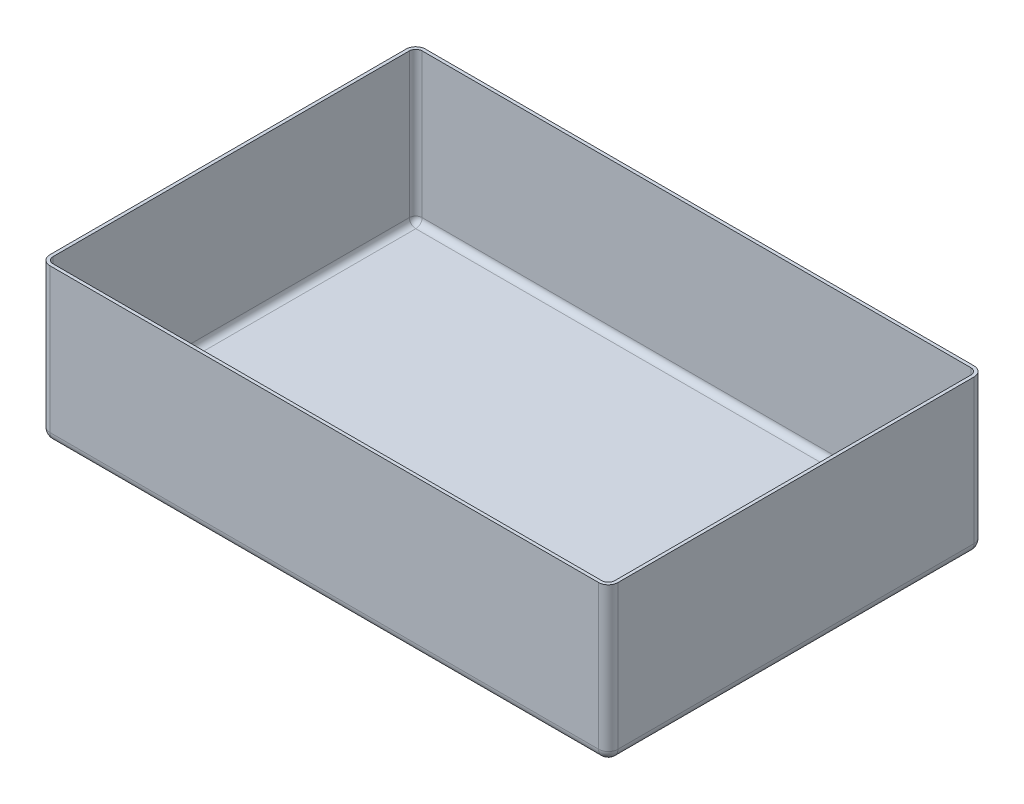
ISO-10303-21;
HEADER;
FILE_DESCRIPTION(('STEP AP214'),'2;1');
FILE_NAME('part.step','',(''),(''),'','','');
FILE_SCHEMA(('AUTOMOTIVE_DESIGN { 1 0 10303 214 1 1 1 1 }'));
ENDSEC;
DATA;
#1=APPLICATION_CONTEXT('core data for automotive mechanical design processes');
#2=APPLICATION_PROTOCOL_DEFINITION('international standard','automotive_design',2000,#1);
#3=PRODUCT_CONTEXT('',#1,'mechanical');
#4=PRODUCT('Part','Part','',(#3));
#5=PRODUCT_RELATED_PRODUCT_CATEGORY('part','',(#4));
#6=PRODUCT_DEFINITION_FORMATION('','',#4);
#7=PRODUCT_DEFINITION_CONTEXT('part definition',#1,'design');
#8=PRODUCT_DEFINITION('design','',#6,#7);
#9=PRODUCT_DEFINITION_SHAPE('','',#8);
#10=(LENGTH_UNIT() NAMED_UNIT(*) SI_UNIT(.MILLI.,.METRE.));
#11=(NAMED_UNIT(*) PLANE_ANGLE_UNIT() SI_UNIT($,.RADIAN.));
#12=(NAMED_UNIT(*) SI_UNIT($,.STERADIAN.) SOLID_ANGLE_UNIT());
#13=UNCERTAINTY_MEASURE_WITH_UNIT(LENGTH_MEASURE(1.E-05),#10,'distance_accuracy_value','');
#14=(GEOMETRIC_REPRESENTATION_CONTEXT(3) GLOBAL_UNCERTAINTY_ASSIGNED_CONTEXT((#13)) GLOBAL_UNIT_ASSIGNED_CONTEXT((#10,
#11,#12)) REPRESENTATION_CONTEXT('',''));
#15=CARTESIAN_POINT('',(0.,0.,0.));
#16=DIRECTION('',(0.,0.,1.));
#17=DIRECTION('',(1.,0.,0.));
#18=AXIS2_PLACEMENT_3D('',#15,#16,#17);
#19=CARTESIAN_POINT('',(-66.2482120522155,48.,-35.084112299842));
#20=DIRECTION('',(1.,0.,0.));
#21=DIRECTION('',(0.,0.,-1.));
#22=AXIS2_PLACEMENT_3D('',#19,#20,#21);
#23=PLANE('',#22);
#24=DIRECTION('',(0.,0.,1.));
#25=VECTOR('',#24,1.);
#26=CARTESIAN_POINT('',(-66.2482120522155,3.,-35.084112299842));
#27=LINE('',#26,#25);
#28=CARTESIAN_POINT('',(-66.2482120522155,3.,-32.084112299842));
#29=VERTEX_POINT('',#28);
#30=CARTESIAN_POINT('',(-66.2482120522155,3.,78.915887700158));
#31=VERTEX_POINT('',#30);
#32=EDGE_CURVE('E60',#29,#31,#27,.T.);
#33=ORIENTED_EDGE('',*,*,#32,.T.);
#34=DIRECTION('',(0.,-1.,0.));
#35=VECTOR('',#34,1.);
#36=CARTESIAN_POINT('',(-66.2482120522155,48.,78.915887700158));
#37=LINE('',#36,#35);
#38=CARTESIAN_POINT('',(-66.2482120522155,48.,78.915887700158));
#39=VERTEX_POINT('',#38);
#40=EDGE_CURVE('E321',#31,#39,#37,.F.);
#41=ORIENTED_EDGE('',*,*,#40,.T.);
#42=DIRECTION('',(0.,0.,1.));
#43=VECTOR('',#42,1.);
#44=CARTESIAN_POINT('',(-66.2482120522155,48.,-35.084112299842));
#45=LINE('',#44,#43);
#46=CARTESIAN_POINT('',(-66.2482120522155,48.,-32.084112299842));
#47=VERTEX_POINT('',#46);
#48=EDGE_CURVE('E278',#47,#39,#45,.T.);
#49=ORIENTED_EDGE('',*,*,#48,.F.);
#50=DIRECTION('',(0.,-1.,0.));
#51=VECTOR('',#50,1.);
#52=CARTESIAN_POINT('',(-66.2482120522155,48.,-32.084112299842));
#53=LINE('',#52,#51);
#54=EDGE_CURVE('E318',#47,#29,#53,.T.);
#55=ORIENTED_EDGE('',*,*,#54,.T.);
#56=EDGE_LOOP('',(#33,#41,#49,#55));
#57=FACE_BOUND('',#56,.T.);
#58=ADVANCED_FACE('F35',(#57),#23,.F.);
#59=CARTESIAN_POINT('',(-66.2482120522155,48.,81.915887700158));
#60=DIRECTION('',(0.,0.,-1.));
#61=DIRECTION('',(-1.,0.,0.));
#62=AXIS2_PLACEMENT_3D('',#59,#60,#61);
#63=PLANE('',#62);
#64=DIRECTION('',(1.,0.,0.));
#65=VECTOR('',#64,1.);
#66=CARTESIAN_POINT('',(-66.2482120522155,3.,81.915887700158));
#67=LINE('',#66,#65);
#68=CARTESIAN_POINT('',(-63.2482120522155,3.,81.915887700158));
#69=VERTEX_POINT('',#68);
#70=CARTESIAN_POINT('',(107.751787947784,3.,81.915887700158));
#71=VERTEX_POINT('',#70);
#72=EDGE_CURVE('E308',#69,#71,#67,.T.);
#73=ORIENTED_EDGE('',*,*,#72,.T.);
#74=DIRECTION('',(0.,-1.,0.));
#75=VECTOR('',#74,1.);
#76=CARTESIAN_POINT('',(107.751787947784,48.,81.915887700158));
#77=LINE('',#76,#75);
#78=CARTESIAN_POINT('',(107.751787947784,48.,81.915887700158));
#79=VERTEX_POINT('',#78);
#80=EDGE_CURVE('E310',#71,#79,#77,.F.);
#81=ORIENTED_EDGE('',*,*,#80,.T.);
#82=DIRECTION('',(1.,0.,0.));
#83=VECTOR('',#82,1.);
#84=CARTESIAN_POINT('',(-66.2482120522155,48.,81.915887700158));
#85=LINE('',#84,#83);
#86=CARTESIAN_POINT('',(-63.2482120522155,48.,81.915887700158));
#87=VERTEX_POINT('',#86);
#88=EDGE_CURVE('E281',#87,#79,#85,.T.);
#89=ORIENTED_EDGE('',*,*,#88,.F.);
#90=DIRECTION('',(0.,-1.,0.));
#91=VECTOR('',#90,1.);
#92=CARTESIAN_POINT('',(-63.2482120522155,48.,81.915887700158));
#93=LINE('',#92,#91);
#94=EDGE_CURVE('E306',#87,#69,#93,.T.);
#95=ORIENTED_EDGE('',*,*,#94,.T.);
#96=EDGE_LOOP('',(#73,#81,#89,#95));
#97=FACE_BOUND('',#96,.T.);
#98=ADVANCED_FACE('F371',(#97),#63,.F.);
#99=CARTESIAN_POINT('',(110.751787947784,48.,-35.084112299842));
#100=DIRECTION('',(-1.,0.,0.));
#101=DIRECTION('',(0.,0.,1.));
#102=AXIS2_PLACEMENT_3D('',#99,#100,#101);
#103=PLANE('',#102);
#104=DIRECTION('',(0.,0.,-1.));
#105=VECTOR('',#104,1.);
#106=CARTESIAN_POINT('',(110.751787947784,3.,-35.084112299842));
#107=LINE('',#106,#105);
#108=CARTESIAN_POINT('',(110.751787947784,3.,78.915887700158));
#109=VERTEX_POINT('',#108);
#110=CARTESIAN_POINT('',(110.751787947784,3.,-32.084112299842));
#111=VERTEX_POINT('',#110);
#112=EDGE_CURVE('E292',#109,#111,#107,.T.);
#113=ORIENTED_EDGE('',*,*,#112,.T.);
#114=DIRECTION('',(0.,-1.,0.));
#115=VECTOR('',#114,1.);
#116=CARTESIAN_POINT('',(110.751787947784,48.,-32.084112299842));
#117=LINE('',#116,#115);
#118=CARTESIAN_POINT('',(110.751787947784,48.,-32.084112299842));
#119=VERTEX_POINT('',#118);
#120=EDGE_CURVE('E295',#111,#119,#117,.F.);
#121=ORIENTED_EDGE('',*,*,#120,.T.);
#122=DIRECTION('',(0.,0.,-1.));
#123=VECTOR('',#122,1.);
#124=CARTESIAN_POINT('',(110.751787947784,48.,-35.084112299842));
#125=LINE('',#124,#123);
#126=CARTESIAN_POINT('',(110.751787947784,48.,78.915887700158));
#127=VERTEX_POINT('',#126);
#128=EDGE_CURVE('E284',#127,#119,#125,.T.);
#129=ORIENTED_EDGE('',*,*,#128,.F.);
#130=DIRECTION('',(0.,-1.,0.));
#131=VECTOR('',#130,1.);
#132=CARTESIAN_POINT('',(110.751787947784,48.,78.915887700158));
#133=LINE('',#132,#131);
#134=EDGE_CURVE('E290',#127,#109,#133,.T.);
#135=ORIENTED_EDGE('',*,*,#134,.T.);
#136=EDGE_LOOP('',(#113,#121,#129,#135));
#137=FACE_BOUND('',#136,.T.);
#138=ADVANCED_FACE('F385',(#137),#103,.F.);
#139=CARTESIAN_POINT('',(-66.2482120522155,48.,-35.084112299842));
#140=DIRECTION('',(0.,0.,1.));
#141=DIRECTION('',(1.,0.,0.));
#142=AXIS2_PLACEMENT_3D('',#139,#140,#141);
#143=PLANE('',#142);
#144=DIRECTION('',(-1.,0.,0.));
#145=VECTOR('',#144,1.);
#146=CARTESIAN_POINT('',(-66.2482120522155,48.,-35.084112299842));
#147=LINE('',#146,#145);
#148=CARTESIAN_POINT('',(107.751787947784,48.,-35.084112299842));
#149=VERTEX_POINT('',#148);
#150=CARTESIAN_POINT('',(-63.2482120522155,48.,-35.084112299842));
#151=VERTEX_POINT('',#150);
#152=EDGE_CURVE('E287',#149,#151,#147,.T.);
#153=ORIENTED_EDGE('',*,*,#152,.F.);
#154=DIRECTION('',(0.,-1.,0.));
#155=VECTOR('',#154,1.);
#156=CARTESIAN_POINT('',(107.751787947784,48.,-35.084112299842));
#157=LINE('',#156,#155);
#158=CARTESIAN_POINT('',(107.751787947784,3.,-35.084112299842));
#159=VERTEX_POINT('',#158);
#160=EDGE_CURVE('E316',#149,#159,#157,.T.);
#161=ORIENTED_EDGE('',*,*,#160,.T.);
#162=DIRECTION('',(-1.,0.,0.));
#163=VECTOR('',#162,1.);
#164=CARTESIAN_POINT('',(-66.2482120522155,3.,-35.084112299842));
#165=LINE('',#164,#163);
#166=CARTESIAN_POINT('',(-63.2482120522155,3.,-35.084112299842));
#167=VERTEX_POINT('',#166);
#168=EDGE_CURVE('E314',#159,#167,#165,.T.);
#169=ORIENTED_EDGE('',*,*,#168,.T.);
#170=DIRECTION('',(0.,-1.,0.));
#171=VECTOR('',#170,1.);
#172=CARTESIAN_POINT('',(-63.2482120522155,48.,-35.084112299842));
#173=LINE('',#172,#171);
#174=EDGE_CURVE('E312',#167,#151,#173,.F.);
#175=ORIENTED_EDGE('',*,*,#174,.T.);
#176=EDGE_LOOP('',(#153,#161,#169,#175));
#177=FACE_BOUND('',#176,.T.);
#178=ADVANCED_FACE('F395',(#177),#143,.F.);
#179=CARTESIAN_POINT('',(0.,48.,0.));
#180=DIRECTION('',(0.,1.,0.));
#181=DIRECTION('',(0.,0.,1.));
#182=AXIS2_PLACEMENT_3D('',#179,#180,#181);
#183=PLANE('',#182);
#184=DIRECTION('',(0.,0.,-1.));
#185=VECTOR('',#184,1.);
#186=CARTESIAN_POINT('',(109.751787947784,48.,-35.084112299842));
#187=LINE('',#186,#185);
#188=CARTESIAN_POINT('',(109.751787947784,48.,78.915887700158));
#189=VERTEX_POINT('',#188);
#190=CARTESIAN_POINT('',(109.751787947784,48.,-32.084112299842));
#191=VERTEX_POINT('',#190);
#192=EDGE_CURVE('E268',#189,#191,#187,.T.);
#193=ORIENTED_EDGE('',*,*,#192,.F.);
#194=CARTESIAN_POINT('',(107.751787947784,48.,78.915887700158));
#195=DIRECTION('',(0.,1.,0.));
#196=DIRECTION('',(0.,0.,1.));
#197=AXIS2_PLACEMENT_3D('',#194,#195,#196);
#198=CIRCLE('',#197,2.);
#199=CARTESIAN_POINT('',(107.751787947784,48.,80.915887700158));
#200=VERTEX_POINT('',#199);
#201=EDGE_CURVE('E266',#200,#189,#198,.T.);
#202=ORIENTED_EDGE('',*,*,#201,.F.);
#203=DIRECTION('',(1.,0.,0.));
#204=VECTOR('',#203,1.);
#205=CARTESIAN_POINT('',(-66.2482120522155,48.,80.915887700158));
#206=LINE('',#205,#204);
#207=CARTESIAN_POINT('',(-63.2482120522155,48.,80.915887700158));
#208=VERTEX_POINT('',#207);
#209=EDGE_CURVE('E52',#208,#200,#206,.T.);
#210=ORIENTED_EDGE('',*,*,#209,.F.);
#211=CARTESIAN_POINT('',(-63.2482120522155,48.,78.915887700158));
#212=DIRECTION('',(0.,1.,0.));
#213=DIRECTION('',(0.,0.,1.));
#214=AXIS2_PLACEMENT_3D('',#211,#212,#213);
#215=CIRCLE('',#214,2.);
#216=CARTESIAN_POINT('',(-65.2482120522155,48.,78.915887700158));
#217=VERTEX_POINT('',#216);
#218=EDGE_CURVE('E264',#217,#208,#215,.T.);
#219=ORIENTED_EDGE('',*,*,#218,.F.);
#220=DIRECTION('',(0.,0.,1.));
#221=VECTOR('',#220,1.);
#222=CARTESIAN_POINT('',(-65.2482120522155,48.,-35.084112299842));
#223=LINE('',#222,#221);
#224=CARTESIAN_POINT('',(-65.2482120522155,48.,-32.084112299842));
#225=VERTEX_POINT('',#224);
#226=EDGE_CURVE('E193',#225,#217,#223,.T.);
#227=ORIENTED_EDGE('',*,*,#226,.F.);
#228=CARTESIAN_POINT('',(-63.2482120522155,48.,-32.084112299842));
#229=DIRECTION('',(0.,1.,0.));
#230=DIRECTION('',(0.,0.,1.));
#231=AXIS2_PLACEMENT_3D('',#228,#229,#230);
#232=CIRCLE('',#231,2.);
#233=CARTESIAN_POINT('',(-63.2482120522155,48.,-34.084112299842));
#234=VERTEX_POINT('',#233);
#235=EDGE_CURVE('E197',#234,#225,#232,.T.);
#236=ORIENTED_EDGE('',*,*,#235,.F.);
#237=DIRECTION('',(-1.,0.,0.));
#238=VECTOR('',#237,1.);
#239=CARTESIAN_POINT('',(-66.2482120522155,48.,-34.084112299842));
#240=LINE('',#239,#238);
#241=CARTESIAN_POINT('',(107.751787947784,48.,-34.084112299842));
#242=VERTEX_POINT('',#241);
#243=EDGE_CURVE('E255',#242,#234,#240,.T.);
#244=ORIENTED_EDGE('',*,*,#243,.F.);
#245=CARTESIAN_POINT('',(107.751787947784,48.,-32.084112299842));
#246=DIRECTION('',(0.,1.,0.));
#247=DIRECTION('',(0.,0.,1.));
#248=AXIS2_PLACEMENT_3D('',#245,#246,#247);
#249=CIRCLE('',#248,2.);
#250=EDGE_CURVE('E270',#191,#242,#249,.T.);
#251=ORIENTED_EDGE('',*,*,#250,.F.);
#252=EDGE_LOOP('',(#193,#202,#210,#219,#227,#236,#244,#251));
#253=FACE_BOUND('',#252,.T.);
#254=ORIENTED_EDGE('',*,*,#128,.T.);
#255=CARTESIAN_POINT('',(107.751787947784,48.,-32.084112299842));
#256=DIRECTION('',(0.,1.,0.));
#257=DIRECTION('',(0.,0.,1.));
#258=AXIS2_PLACEMENT_3D('',#255,#256,#257);
#259=CIRCLE('',#258,3.);
#260=EDGE_CURVE('E11',#119,#149,#259,.T.);
#261=ORIENTED_EDGE('',*,*,#260,.T.);
#262=ORIENTED_EDGE('',*,*,#152,.T.);
#263=CARTESIAN_POINT('',(-63.2482120522155,48.,-32.084112299842));
#264=DIRECTION('',(0.,1.,0.));
#265=DIRECTION('',(0.,0.,1.));
#266=AXIS2_PLACEMENT_3D('',#263,#264,#265);
#267=CIRCLE('',#266,3.);
#268=EDGE_CURVE('E323',#151,#47,#267,.T.);
#269=ORIENTED_EDGE('',*,*,#268,.T.);
#270=ORIENTED_EDGE('',*,*,#48,.T.);
#271=CARTESIAN_POINT('',(-63.2482120522155,48.,78.915887700158));
#272=DIRECTION('',(0.,1.,0.));
#273=DIRECTION('',(0.,0.,1.));
#274=AXIS2_PLACEMENT_3D('',#271,#272,#273);
#275=CIRCLE('',#274,3.);
#276=EDGE_CURVE('E325',#39,#87,#275,.T.);
#277=ORIENTED_EDGE('',*,*,#276,.T.);
#278=ORIENTED_EDGE('',*,*,#88,.T.);
#279=CARTESIAN_POINT('',(107.751787947784,48.,78.915887700158));
#280=DIRECTION('',(0.,1.,0.));
#281=DIRECTION('',(0.,0.,1.));
#282=AXIS2_PLACEMENT_3D('',#279,#280,#281);
#283=CIRCLE('',#282,3.);
#284=EDGE_CURVE('E44',#79,#127,#283,.T.);
#285=ORIENTED_EDGE('',*,*,#284,.T.);
#286=EDGE_LOOP('',(#254,#261,#262,#269,#270,#277,#278,#285));
#287=FACE_BOUND('',#286,.T.);
#288=ADVANCED_FACE('F382',(#253,#287),#183,.T.);
#289=CARTESIAN_POINT('',(0.,0.,0.));
#290=DIRECTION('',(0.,1.,0.));
#291=DIRECTION('',(0.,0.,1.));
#292=AXIS2_PLACEMENT_3D('',#289,#290,#291);
#293=PLANE('',#292);
#294=DIRECTION('',(-1.,0.,0.));
#295=VECTOR('',#294,1.);
#296=CARTESIAN_POINT('',(0.,0.,-32.084112299842));
#297=LINE('',#296,#295);
#298=CARTESIAN_POINT('',(-63.2482120522155,0.,-32.084112299842));
#299=VERTEX_POINT('',#298);
#300=CARTESIAN_POINT('',(107.751787947784,0.,-32.084112299842));
#301=VERTEX_POINT('',#300);
#302=EDGE_CURVE('E299',#299,#301,#297,.F.);
#303=ORIENTED_EDGE('',*,*,#302,.T.);
#304=DIRECTION('',(0.,0.,-1.));
#305=VECTOR('',#304,1.);
#306=CARTESIAN_POINT('',(107.751787947784,0.,0.));
#307=LINE('',#306,#305);
#308=CARTESIAN_POINT('',(107.751787947784,0.,78.915887700158));
#309=VERTEX_POINT('',#308);
#310=EDGE_CURVE('E303',#301,#309,#307,.F.);
#311=ORIENTED_EDGE('',*,*,#310,.T.);
#312=DIRECTION('',(1.,0.,0.));
#313=VECTOR('',#312,1.);
#314=CARTESIAN_POINT('',(0.,0.,78.915887700158));
#315=LINE('',#314,#313);
#316=CARTESIAN_POINT('',(-63.2482120522155,0.,78.915887700158));
#317=VERTEX_POINT('',#316);
#318=EDGE_CURVE('E301',#309,#317,#315,.F.);
#319=ORIENTED_EDGE('',*,*,#318,.T.);
#320=DIRECTION('',(0.,0.,1.));
#321=VECTOR('',#320,1.);
#322=CARTESIAN_POINT('',(-63.2482120522155,0.,0.));
#323=LINE('',#322,#321);
#324=EDGE_CURVE('E297',#317,#299,#323,.F.);
#325=ORIENTED_EDGE('',*,*,#324,.T.);
#326=EDGE_LOOP('',(#303,#311,#319,#325));
#327=FACE_BOUND('',#326,.T.);
#328=ADVANCED_FACE('F412',(#327),#293,.F.);
#329=CARTESIAN_POINT('',(-63.2482120522155,48.,78.915887700158));
#330=DIRECTION('',(0.,-1.,0.));
#331=DIRECTION('',(0.,0.,-1.));
#332=AXIS2_PLACEMENT_3D('',#329,#330,#331);
#333=CYLINDRICAL_SURFACE('',#332,3.);
#334=ORIENTED_EDGE('',*,*,#276,.F.);
#335=ORIENTED_EDGE('',*,*,#40,.F.);
#336=CARTESIAN_POINT('',(-63.2482120522155,3.,78.915887700158));
#337=DIRECTION('',(0.,-1.,0.));
#338=DIRECTION('',(0.,0.,-1.));
#339=AXIS2_PLACEMENT_3D('',#336,#337,#338);
#340=CIRCLE('',#339,3.);
#341=EDGE_CURVE('E354',#69,#31,#340,.T.);
#342=ORIENTED_EDGE('',*,*,#341,.F.);
#343=ORIENTED_EDGE('',*,*,#94,.F.);
#344=EDGE_LOOP('',(#334,#335,#342,#343));
#345=FACE_BOUND('',#344,.T.);
#346=ADVANCED_FACE('F37',(#345),#333,.T.);
#347=CARTESIAN_POINT('',(-63.2482120522155,48.,-32.084112299842));
#348=DIRECTION('',(0.,-1.,0.));
#349=DIRECTION('',(0.,0.,-1.));
#350=AXIS2_PLACEMENT_3D('',#347,#348,#349);
#351=CYLINDRICAL_SURFACE('',#350,3.);
#352=ORIENTED_EDGE('',*,*,#268,.F.);
#353=ORIENTED_EDGE('',*,*,#174,.F.);
#354=CARTESIAN_POINT('',(-63.2482120522155,3.,-32.084112299842));
#355=DIRECTION('',(0.,-1.,0.));
#356=DIRECTION('',(0.,0.,-1.));
#357=AXIS2_PLACEMENT_3D('',#354,#355,#356);
#358=CIRCLE('',#357,3.);
#359=EDGE_CURVE('E352',#29,#167,#358,.T.);
#360=ORIENTED_EDGE('',*,*,#359,.F.);
#361=ORIENTED_EDGE('',*,*,#54,.F.);
#362=EDGE_LOOP('',(#352,#353,#360,#361));
#363=FACE_BOUND('',#362,.T.);
#364=ADVANCED_FACE('F400',(#363),#351,.T.);
#365=CARTESIAN_POINT('',(-63.2482120522155,3.,-35.084112299842));
#366=DIRECTION('',(0.,0.,1.));
#367=DIRECTION('',(1.,0.,0.));
#368=AXIS2_PLACEMENT_3D('',#365,#366,#367);
#369=CYLINDRICAL_SURFACE('',#368,3.);
#370=CARTESIAN_POINT('',(-63.2482120522155,3.,78.915887700158));
#371=DIRECTION('',(0.,0.,1.));
#372=DIRECTION('',(1.,0.,0.));
#373=AXIS2_PLACEMENT_3D('',#370,#371,#372);
#374=CIRCLE('',#373,3.);
#375=EDGE_CURVE('E39',#31,#317,#374,.T.);
#376=ORIENTED_EDGE('',*,*,#375,.F.);
#377=ORIENTED_EDGE('',*,*,#32,.F.);
#378=CARTESIAN_POINT('',(-63.2482120522155,3.,-32.084112299842));
#379=DIRECTION('',(0.,0.,-1.));
#380=DIRECTION('',(-1.,0.,0.));
#381=AXIS2_PLACEMENT_3D('',#378,#379,#380);
#382=CIRCLE('',#381,3.);
#383=EDGE_CURVE('E349',#299,#29,#382,.T.);
#384=ORIENTED_EDGE('',*,*,#383,.F.);
#385=ORIENTED_EDGE('',*,*,#324,.F.);
#386=EDGE_LOOP('',(#376,#377,#384,#385));
#387=FACE_BOUND('',#386,.T.);
#388=ADVANCED_FACE('F413',(#387),#369,.T.);
#389=CARTESIAN_POINT('',(-63.2482120522155,3.,78.915887700158));
#390=DIRECTION('',(0.,0.,1.));
#391=DIRECTION('',(1.,0.,0.));
#392=AXIS2_PLACEMENT_3D('',#389,#390,#391);
#393=SPHERICAL_SURFACE('',#392,3.);
#394=ORIENTED_EDGE('',*,*,#341,.T.);
#395=ORIENTED_EDGE('',*,*,#375,.T.);
#396=CARTESIAN_POINT('',(-63.2482120522155,3.,78.915887700158));
#397=DIRECTION('',(-1.,0.,0.));
#398=DIRECTION('',(0.,0.,1.));
#399=AXIS2_PLACEMENT_3D('',#396,#397,#398);
#400=CIRCLE('',#399,3.);
#401=EDGE_CURVE('E346',#69,#317,#400,.F.);
#402=ORIENTED_EDGE('',*,*,#401,.F.);
#403=EDGE_LOOP('',(#394,#395,#402));
#404=FACE_BOUND('',#403,.T.);
#405=ADVANCED_FACE('F361',(#404),#393,.T.);
#406=CARTESIAN_POINT('',(-63.2482120522155,3.,-32.084112299842));
#407=DIRECTION('',(0.,0.,1.));
#408=DIRECTION('',(1.,0.,0.));
#409=AXIS2_PLACEMENT_3D('',#406,#407,#408);
#410=SPHERICAL_SURFACE('',#409,3.);
#411=ORIENTED_EDGE('',*,*,#383,.T.);
#412=ORIENTED_EDGE('',*,*,#359,.T.);
#413=CARTESIAN_POINT('',(-63.2482120522155,3.,-32.084112299842));
#414=DIRECTION('',(-1.,0.,0.));
#415=DIRECTION('',(0.,0.,1.));
#416=AXIS2_PLACEMENT_3D('',#413,#414,#415);
#417=CIRCLE('',#416,3.);
#418=EDGE_CURVE('E343',#299,#167,#417,.F.);
#419=ORIENTED_EDGE('',*,*,#418,.F.);
#420=EDGE_LOOP('',(#411,#412,#419));
#421=FACE_BOUND('',#420,.T.);
#422=ADVANCED_FACE('F404',(#421),#410,.T.);
#423=CARTESIAN_POINT('',(-66.2482120522155,3.,78.915887700158));
#424=DIRECTION('',(1.,0.,0.));
#425=DIRECTION('',(0.,0.,-1.));
#426=AXIS2_PLACEMENT_3D('',#423,#424,#425);
#427=CYLINDRICAL_SURFACE('',#426,3.);
#428=ORIENTED_EDGE('',*,*,#401,.T.);
#429=ORIENTED_EDGE('',*,*,#318,.F.);
#430=CARTESIAN_POINT('',(107.751787947784,3.,78.915887700158));
#431=DIRECTION('',(1.,0.,0.));
#432=DIRECTION('',(0.,0.,-1.));
#433=AXIS2_PLACEMENT_3D('',#430,#431,#432);
#434=CIRCLE('',#433,3.);
#435=EDGE_CURVE('E340',#71,#309,#434,.T.);
#436=ORIENTED_EDGE('',*,*,#435,.F.);
#437=ORIENTED_EDGE('',*,*,#72,.F.);
#438=EDGE_LOOP('',(#428,#429,#436,#437));
#439=FACE_BOUND('',#438,.T.);
#440=ADVANCED_FACE('F367',(#439),#427,.T.);
#441=CARTESIAN_POINT('',(107.751787947784,48.,78.915887700158));
#442=DIRECTION('',(0.,-1.,0.));
#443=DIRECTION('',(0.,0.,-1.));
#444=AXIS2_PLACEMENT_3D('',#441,#442,#443);
#445=CYLINDRICAL_SURFACE('',#444,3.);
#446=ORIENTED_EDGE('',*,*,#284,.F.);
#447=ORIENTED_EDGE('',*,*,#80,.F.);
#448=CARTESIAN_POINT('',(107.751787947784,3.,78.915887700158));
#449=DIRECTION('',(0.,-1.,0.));
#450=DIRECTION('',(0.,0.,-1.));
#451=AXIS2_PLACEMENT_3D('',#448,#449,#450);
#452=CIRCLE('',#451,3.);
#453=EDGE_CURVE('E337',#109,#71,#452,.T.);
#454=ORIENTED_EDGE('',*,*,#453,.F.);
#455=ORIENTED_EDGE('',*,*,#134,.F.);
#456=EDGE_LOOP('',(#446,#447,#454,#455));
#457=FACE_BOUND('',#456,.T.);
#458=ADVANCED_FACE('F377',(#457),#445,.T.);
#459=CARTESIAN_POINT('',(107.751787947784,48.,-32.084112299842));
#460=DIRECTION('',(0.,-1.,0.));
#461=DIRECTION('',(0.,0.,-1.));
#462=AXIS2_PLACEMENT_3D('',#459,#460,#461);
#463=CYLINDRICAL_SURFACE('',#462,3.);
#464=ORIENTED_EDGE('',*,*,#260,.F.);
#465=ORIENTED_EDGE('',*,*,#120,.F.);
#466=CARTESIAN_POINT('',(107.751787947784,3.,-32.084112299842));
#467=DIRECTION('',(0.,-1.,0.));
#468=DIRECTION('',(0.,0.,-1.));
#469=AXIS2_PLACEMENT_3D('',#466,#467,#468);
#470=CIRCLE('',#469,3.);
#471=EDGE_CURVE('E334',#159,#111,#470,.T.);
#472=ORIENTED_EDGE('',*,*,#471,.F.);
#473=ORIENTED_EDGE('',*,*,#160,.F.);
#474=EDGE_LOOP('',(#464,#465,#472,#473));
#475=FACE_BOUND('',#474,.T.);
#476=ADVANCED_FACE('F390',(#475),#463,.T.);
#477=CARTESIAN_POINT('',(-66.2482120522155,3.,-32.084112299842));
#478=DIRECTION('',(-1.,0.,0.));
#479=DIRECTION('',(0.,0.,1.));
#480=AXIS2_PLACEMENT_3D('',#477,#478,#479);
#481=CYLINDRICAL_SURFACE('',#480,3.);
#482=ORIENTED_EDGE('',*,*,#418,.T.);
#483=ORIENTED_EDGE('',*,*,#168,.F.);
#484=CARTESIAN_POINT('',(107.751787947784,3.,-32.084112299842));
#485=DIRECTION('',(1.,0.,0.));
#486=DIRECTION('',(0.,0.,-1.));
#487=AXIS2_PLACEMENT_3D('',#484,#485,#486);
#488=CIRCLE('',#487,3.);
#489=EDGE_CURVE('E331',#301,#159,#488,.T.);
#490=ORIENTED_EDGE('',*,*,#489,.F.);
#491=ORIENTED_EDGE('',*,*,#302,.F.);
#492=EDGE_LOOP('',(#482,#483,#490,#491));
#493=FACE_BOUND('',#492,.T.);
#494=ADVANCED_FACE('F408',(#493),#481,.T.);
#495=CARTESIAN_POINT('',(107.751787947784,3.,78.915887700158));
#496=DIRECTION('',(0.,0.,1.));
#497=DIRECTION('',(1.,0.,0.));
#498=AXIS2_PLACEMENT_3D('',#495,#496,#497);
#499=SPHERICAL_SURFACE('',#498,3.);
#500=ORIENTED_EDGE('',*,*,#453,.T.);
#501=ORIENTED_EDGE('',*,*,#435,.T.);
#502=CARTESIAN_POINT('',(107.751787947784,3.,78.915887700158));
#503=DIRECTION('',(0.,0.,1.));
#504=DIRECTION('',(1.,0.,0.));
#505=AXIS2_PLACEMENT_3D('',#502,#503,#504);
#506=CIRCLE('',#505,3.);
#507=EDGE_CURVE('E329',#109,#309,#506,.F.);
#508=ORIENTED_EDGE('',*,*,#507,.F.);
#509=EDGE_LOOP('',(#500,#501,#508));
#510=FACE_BOUND('',#509,.T.);
#511=ADVANCED_FACE('F436',(#510),#499,.T.);
#512=CARTESIAN_POINT('',(107.751787947784,3.,-32.084112299842));
#513=DIRECTION('',(0.,0.,1.));
#514=DIRECTION('',(1.,0.,0.));
#515=AXIS2_PLACEMENT_3D('',#512,#513,#514);
#516=SPHERICAL_SURFACE('',#515,3.);
#517=ORIENTED_EDGE('',*,*,#489,.T.);
#518=ORIENTED_EDGE('',*,*,#471,.T.);
#519=CARTESIAN_POINT('',(107.751787947784,3.,-32.084112299842));
#520=DIRECTION('',(0.,0.,-1.));
#521=DIRECTION('',(-1.,0.,0.));
#522=AXIS2_PLACEMENT_3D('',#519,#520,#521);
#523=CIRCLE('',#522,3.);
#524=EDGE_CURVE('E274',#301,#111,#523,.F.);
#525=ORIENTED_EDGE('',*,*,#524,.F.);
#526=EDGE_LOOP('',(#517,#518,#525));
#527=FACE_BOUND('',#526,.T.);
#528=ADVANCED_FACE('F432',(#527),#516,.T.);
#529=CARTESIAN_POINT('',(107.751787947784,3.,-35.084112299842));
#530=DIRECTION('',(0.,0.,-1.));
#531=DIRECTION('',(-1.,0.,0.));
#532=AXIS2_PLACEMENT_3D('',#529,#530,#531);
#533=CYLINDRICAL_SURFACE('',#532,3.);
#534=ORIENTED_EDGE('',*,*,#507,.T.);
#535=ORIENTED_EDGE('',*,*,#310,.F.);
#536=ORIENTED_EDGE('',*,*,#524,.T.);
#537=ORIENTED_EDGE('',*,*,#112,.F.);
#538=EDGE_LOOP('',(#534,#535,#536,#537));
#539=FACE_BOUND('',#538,.T.);
#540=ADVANCED_FACE('F429',(#539),#533,.T.);
#541=CARTESIAN_POINT('',(-65.2482120522155,48.,-35.084112299842));
#542=DIRECTION('',(1.,0.,0.));
#543=DIRECTION('',(0.,0.,-1.));
#544=AXIS2_PLACEMENT_3D('',#541,#542,#543);
#545=PLANE('',#544);
#546=DIRECTION('',(0.,0.,-1.));
#547=VECTOR('',#546,1.);
#548=CARTESIAN_POINT('',(-65.2482120522155,3.,-35.084112299842));
#549=LINE('',#548,#547);
#550=CARTESIAN_POINT('',(-65.2482120522155,3.,-32.084112299842));
#551=VERTEX_POINT('',#550);
#552=CARTESIAN_POINT('',(-65.2482120522155,3.,78.915887700158));
#553=VERTEX_POINT('',#552);
#554=EDGE_CURVE('E176',#551,#553,#549,.F.);
#555=ORIENTED_EDGE('',*,*,#554,.F.);
#556=DIRECTION('',(0.,1.,0.));
#557=VECTOR('',#556,1.);
#558=CARTESIAN_POINT('',(-65.2482120522155,48.,-32.084112299842));
#559=LINE('',#558,#557);
#560=EDGE_CURVE('E188',#225,#551,#559,.F.);
#561=ORIENTED_EDGE('',*,*,#560,.F.);
#562=ORIENTED_EDGE('',*,*,#226,.T.);
#563=DIRECTION('',(0.,1.,0.));
#564=VECTOR('',#563,1.);
#565=CARTESIAN_POINT('',(-65.2482120522155,48.,78.915887700158));
#566=LINE('',#565,#564);
#567=EDGE_CURVE('E187',#553,#217,#566,.T.);
#568=ORIENTED_EDGE('',*,*,#567,.F.);
#569=EDGE_LOOP('',(#555,#561,#562,#568));
#570=FACE_BOUND('',#569,.T.);
#571=ADVANCED_FACE('F191',(#570),#545,.T.);
#572=CARTESIAN_POINT('',(-66.2482120522155,48.,80.915887700158));
#573=DIRECTION('',(0.,0.,-1.));
#574=DIRECTION('',(-1.,0.,0.));
#575=AXIS2_PLACEMENT_3D('',#572,#573,#574);
#576=PLANE('',#575);
#577=DIRECTION('',(-1.,0.,0.));
#578=VECTOR('',#577,1.);
#579=CARTESIAN_POINT('',(-66.2482120522155,3.,80.915887700158));
#580=LINE('',#579,#578);
#581=CARTESIAN_POINT('',(-63.2482120522155,3.,80.915887700158));
#582=VERTEX_POINT('',#581);
#583=CARTESIAN_POINT('',(107.751787947784,3.,80.915887700158));
#584=VERTEX_POINT('',#583);
#585=EDGE_CURVE('E215',#582,#584,#580,.F.);
#586=ORIENTED_EDGE('',*,*,#585,.F.);
#587=DIRECTION('',(0.,1.,0.));
#588=VECTOR('',#587,1.);
#589=CARTESIAN_POINT('',(-63.2482120522155,48.,80.915887700158));
#590=LINE('',#589,#588);
#591=EDGE_CURVE('E207',#208,#582,#590,.F.);
#592=ORIENTED_EDGE('',*,*,#591,.F.);
#593=ORIENTED_EDGE('',*,*,#209,.T.);
#594=DIRECTION('',(0.,1.,0.));
#595=VECTOR('',#594,1.);
#596=CARTESIAN_POINT('',(107.751787947784,48.,80.915887700158));
#597=LINE('',#596,#595);
#598=EDGE_CURVE('E218',#584,#200,#597,.T.);
#599=ORIENTED_EDGE('',*,*,#598,.F.);
#600=EDGE_LOOP('',(#586,#592,#593,#599));
#601=FACE_BOUND('',#600,.T.);
#602=ADVANCED_FACE('F489',(#601),#576,.T.);
#603=CARTESIAN_POINT('',(109.751787947784,48.,-35.084112299842));
#604=DIRECTION('',(-1.,0.,0.));
#605=DIRECTION('',(0.,0.,1.));
#606=AXIS2_PLACEMENT_3D('',#603,#604,#605);
#607=PLANE('',#606);
#608=DIRECTION('',(0.,0.,1.));
#609=VECTOR('',#608,1.);
#610=CARTESIAN_POINT('',(109.751787947784,3.,-35.084112299842));
#611=LINE('',#610,#609);
#612=CARTESIAN_POINT('',(109.751787947784,3.,78.915887700158));
#613=VERTEX_POINT('',#612);
#614=CARTESIAN_POINT('',(109.751787947784,3.,-32.084112299842));
#615=VERTEX_POINT('',#614);
#616=EDGE_CURVE('E247',#613,#615,#611,.F.);
#617=ORIENTED_EDGE('',*,*,#616,.F.);
#618=DIRECTION('',(0.,1.,0.));
#619=VECTOR('',#618,1.);
#620=CARTESIAN_POINT('',(109.751787947784,48.,78.915887700158));
#621=LINE('',#620,#619);
#622=EDGE_CURVE('E253',#189,#613,#621,.F.);
#623=ORIENTED_EDGE('',*,*,#622,.F.);
#624=ORIENTED_EDGE('',*,*,#192,.T.);
#625=DIRECTION('',(0.,1.,0.));
#626=VECTOR('',#625,1.);
#627=CARTESIAN_POINT('',(109.751787947784,48.,-32.084112299842));
#628=LINE('',#627,#626);
#629=EDGE_CURVE('E231',#615,#191,#628,.T.);
#630=ORIENTED_EDGE('',*,*,#629,.F.);
#631=EDGE_LOOP('',(#617,#623,#624,#630));
#632=FACE_BOUND('',#631,.T.);
#633=ADVANCED_FACE('F496',(#632),#607,.T.);
#634=CARTESIAN_POINT('',(-66.2482120522155,48.,-34.084112299842));
#635=DIRECTION('',(0.,0.,1.));
#636=DIRECTION('',(1.,0.,0.));
#637=AXIS2_PLACEMENT_3D('',#634,#635,#636);
#638=PLANE('',#637);
#639=ORIENTED_EDGE('',*,*,#243,.T.);
#640=DIRECTION('',(0.,1.,0.));
#641=VECTOR('',#640,1.);
#642=CARTESIAN_POINT('',(-63.2482120522155,48.,-34.084112299842));
#643=LINE('',#642,#641);
#644=CARTESIAN_POINT('',(-63.2482120522155,3.,-34.084112299842));
#645=VERTEX_POINT('',#644);
#646=EDGE_CURVE('E219',#645,#234,#643,.T.);
#647=ORIENTED_EDGE('',*,*,#646,.F.);
#648=DIRECTION('',(1.,0.,0.));
#649=VECTOR('',#648,1.);
#650=CARTESIAN_POINT('',(-66.2482120522155,3.,-34.084112299842));
#651=LINE('',#650,#649);
#652=CARTESIAN_POINT('',(107.751787947784,3.,-34.084112299842));
#653=VERTEX_POINT('',#652);
#654=EDGE_CURVE('E233',#653,#645,#651,.F.);
#655=ORIENTED_EDGE('',*,*,#654,.F.);
#656=DIRECTION('',(0.,1.,0.));
#657=VECTOR('',#656,1.);
#658=CARTESIAN_POINT('',(107.751787947784,48.,-34.084112299842));
#659=LINE('',#658,#657);
#660=EDGE_CURVE('E235',#242,#653,#659,.F.);
#661=ORIENTED_EDGE('',*,*,#660,.F.);
#662=EDGE_LOOP('',(#639,#647,#655,#661));
#663=FACE_BOUND('',#662,.T.);
#664=ADVANCED_FACE('F503',(#663),#638,.T.);
#665=CARTESIAN_POINT('',(0.,1.,0.));
#666=DIRECTION('',(0.,1.,0.));
#667=DIRECTION('',(0.,0.,1.));
#668=AXIS2_PLACEMENT_3D('',#665,#666,#667);
#669=PLANE('',#668);
#670=DIRECTION('',(1.,0.,0.));
#671=VECTOR('',#670,1.);
#672=CARTESIAN_POINT('',(0.,1.,-32.084112299842));
#673=LINE('',#672,#671);
#674=CARTESIAN_POINT('',(-63.2482120522155,1.,-32.084112299842));
#675=VERTEX_POINT('',#674);
#676=CARTESIAN_POINT('',(107.751787947784,1.,-32.084112299842));
#677=VERTEX_POINT('',#676);
#678=EDGE_CURVE('E223',#675,#677,#673,.T.);
#679=ORIENTED_EDGE('',*,*,#678,.F.);
#680=DIRECTION('',(0.,0.,1.));
#681=VECTOR('',#680,1.);
#682=CARTESIAN_POINT('',(-63.2482120522155,1.,0.));
#683=LINE('',#682,#681);
#684=CARTESIAN_POINT('',(-63.2482120522155,1.,78.915887700158));
#685=VERTEX_POINT('',#684);
#686=EDGE_CURVE('E226',#685,#675,#683,.F.);
#687=ORIENTED_EDGE('',*,*,#686,.F.);
#688=DIRECTION('',(1.,0.,0.));
#689=VECTOR('',#688,1.);
#690=CARTESIAN_POINT('',(0.,1.,78.915887700158));
#691=LINE('',#690,#689);
#692=CARTESIAN_POINT('',(107.751787947784,1.,78.915887700158));
#693=VERTEX_POINT('',#692);
#694=EDGE_CURVE('E225',#693,#685,#691,.F.);
#695=ORIENTED_EDGE('',*,*,#694,.F.);
#696=DIRECTION('',(0.,0.,1.));
#697=VECTOR('',#696,1.);
#698=CARTESIAN_POINT('',(107.751787947784,1.,0.));
#699=LINE('',#698,#697);
#700=EDGE_CURVE('E216',#677,#693,#699,.T.);
#701=ORIENTED_EDGE('',*,*,#700,.F.);
#702=EDGE_LOOP('',(#679,#687,#695,#701));
#703=FACE_BOUND('',#702,.T.);
#704=ADVANCED_FACE('F511',(#703),#669,.T.);
#705=CARTESIAN_POINT('',(-63.2482120522155,48.,78.915887700158));
#706=DIRECTION('',(0.,-1.,0.));
#707=DIRECTION('',(0.,0.,-1.));
#708=AXIS2_PLACEMENT_3D('',#705,#706,#707);
#709=CYLINDRICAL_SURFACE('',#708,2.);
#710=ORIENTED_EDGE('',*,*,#218,.T.);
#711=ORIENTED_EDGE('',*,*,#591,.T.);
#712=CARTESIAN_POINT('',(-63.2482120522155,3.,78.915887700158));
#713=DIRECTION('',(0.,1.,0.));
#714=DIRECTION('',(-1.,0.,0.));
#715=AXIS2_PLACEMENT_3D('',#712,#713,#714);
#716=CIRCLE('',#715,2.);
#717=EDGE_CURVE('E202',#582,#553,#716,.F.);
#718=ORIENTED_EDGE('',*,*,#717,.T.);
#719=ORIENTED_EDGE('',*,*,#567,.T.);
#720=EDGE_LOOP('',(#710,#711,#718,#719));
#721=FACE_BOUND('',#720,.T.);
#722=ADVANCED_FACE('F206',(#721),#709,.F.);
#723=CARTESIAN_POINT('',(-63.2482120522155,48.,-32.084112299842));
#724=DIRECTION('',(0.,-1.,0.));
#725=DIRECTION('',(0.,0.,-1.));
#726=AXIS2_PLACEMENT_3D('',#723,#724,#725);
#727=CYLINDRICAL_SURFACE('',#726,2.);
#728=ORIENTED_EDGE('',*,*,#235,.T.);
#729=ORIENTED_EDGE('',*,*,#560,.T.);
#730=CARTESIAN_POINT('',(-63.2482120522155,3.,-32.084112299842));
#731=DIRECTION('',(0.,1.,0.));
#732=DIRECTION('',(-1.,0.,0.));
#733=AXIS2_PLACEMENT_3D('',#730,#731,#732);
#734=CIRCLE('',#733,2.);
#735=EDGE_CURVE('E208',#551,#645,#734,.F.);
#736=ORIENTED_EDGE('',*,*,#735,.T.);
#737=ORIENTED_EDGE('',*,*,#646,.T.);
#738=EDGE_LOOP('',(#728,#729,#736,#737));
#739=FACE_BOUND('',#738,.T.);
#740=ADVANCED_FACE('F526',(#739),#727,.F.);
#741=CARTESIAN_POINT('',(-63.2482120522155,3.,-35.084112299842));
#742=DIRECTION('',(0.,0.,1.));
#743=DIRECTION('',(1.,0.,0.));
#744=AXIS2_PLACEMENT_3D('',#741,#742,#743);
#745=CYLINDRICAL_SURFACE('',#744,2.);
#746=CARTESIAN_POINT('',(-63.2482120522155,3.,78.915887700158));
#747=DIRECTION('',(0.,0.,1.));
#748=DIRECTION('',(1.,0.,0.));
#749=AXIS2_PLACEMENT_3D('',#746,#747,#748);
#750=CIRCLE('',#749,2.);
#751=EDGE_CURVE('E180',#553,#685,#750,.T.);
#752=ORIENTED_EDGE('',*,*,#751,.T.);
#753=ORIENTED_EDGE('',*,*,#686,.T.);
#754=CARTESIAN_POINT('',(-63.2482120522155,3.,-32.084112299842));
#755=DIRECTION('',(0.,0.,1.));
#756=DIRECTION('',(1.,0.,0.));
#757=AXIS2_PLACEMENT_3D('',#754,#755,#756);
#758=CIRCLE('',#757,2.);
#759=EDGE_CURVE('E183',#675,#551,#758,.F.);
#760=ORIENTED_EDGE('',*,*,#759,.T.);
#761=ORIENTED_EDGE('',*,*,#554,.T.);
#762=EDGE_LOOP('',(#752,#753,#760,#761));
#763=FACE_BOUND('',#762,.T.);
#764=ADVANCED_FACE('F178',(#763),#745,.F.);
#765=CARTESIAN_POINT('',(-63.2482120522155,3.,78.915887700158));
#766=DIRECTION('',(0.,0.,1.));
#767=DIRECTION('',(1.,0.,0.));
#768=AXIS2_PLACEMENT_3D('',#765,#766,#767);
#769=SPHERICAL_SURFACE('',#768,2.);
#770=ORIENTED_EDGE('',*,*,#717,.F.);
#771=CARTESIAN_POINT('',(-63.2482120522155,3.,78.915887700158));
#772=DIRECTION('',(1.,0.,0.));
#773=DIRECTION('',(0.,0.,-1.));
#774=AXIS2_PLACEMENT_3D('',#771,#772,#773);
#775=CIRCLE('',#774,2.);
#776=EDGE_CURVE('E204',#582,#685,#775,.T.);
#777=ORIENTED_EDGE('',*,*,#776,.T.);
#778=ORIENTED_EDGE('',*,*,#751,.F.);
#779=EDGE_LOOP('',(#770,#777,#778));
#780=FACE_BOUND('',#779,.T.);
#781=ADVANCED_FACE('F201',(#780),#769,.F.);
#782=CARTESIAN_POINT('',(-63.2482120522155,3.,-32.084112299842));
#783=DIRECTION('',(0.,0.,1.));
#784=DIRECTION('',(1.,0.,0.));
#785=AXIS2_PLACEMENT_3D('',#782,#783,#784);
#786=SPHERICAL_SURFACE('',#785,2.);
#787=ORIENTED_EDGE('',*,*,#759,.F.);
#788=CARTESIAN_POINT('',(-63.2482120522155,3.,-32.084112299842));
#789=DIRECTION('',(-1.,0.,0.));
#790=DIRECTION('',(0.,0.,1.));
#791=AXIS2_PLACEMENT_3D('',#788,#789,#790);
#792=CIRCLE('',#791,2.);
#793=EDGE_CURVE('E222',#675,#645,#792,.F.);
#794=ORIENTED_EDGE('',*,*,#793,.T.);
#795=ORIENTED_EDGE('',*,*,#735,.F.);
#796=EDGE_LOOP('',(#787,#794,#795));
#797=FACE_BOUND('',#796,.T.);
#798=ADVANCED_FACE('F546',(#797),#786,.F.);
#799=CARTESIAN_POINT('',(-66.2482120522155,3.,78.915887700158));
#800=DIRECTION('',(1.,0.,0.));
#801=DIRECTION('',(0.,0.,-1.));
#802=AXIS2_PLACEMENT_3D('',#799,#800,#801);
#803=CYLINDRICAL_SURFACE('',#802,2.);
#804=ORIENTED_EDGE('',*,*,#776,.F.);
#805=ORIENTED_EDGE('',*,*,#585,.T.);
#806=CARTESIAN_POINT('',(107.751787947784,3.,78.915887700158));
#807=DIRECTION('',(-1.,0.,0.));
#808=DIRECTION('',(0.,-1.,0.));
#809=AXIS2_PLACEMENT_3D('',#806,#807,#808);
#810=CIRCLE('',#809,2.);
#811=EDGE_CURVE('E240',#584,#693,#810,.F.);
#812=ORIENTED_EDGE('',*,*,#811,.T.);
#813=ORIENTED_EDGE('',*,*,#694,.T.);
#814=EDGE_LOOP('',(#804,#805,#812,#813));
#815=FACE_BOUND('',#814,.T.);
#816=ADVANCED_FACE('F553',(#815),#803,.F.);
#817=CARTESIAN_POINT('',(107.751787947784,48.,78.915887700158));
#818=DIRECTION('',(0.,-1.,0.));
#819=DIRECTION('',(0.,0.,-1.));
#820=AXIS2_PLACEMENT_3D('',#817,#818,#819);
#821=CYLINDRICAL_SURFACE('',#820,2.);
#822=ORIENTED_EDGE('',*,*,#201,.T.);
#823=ORIENTED_EDGE('',*,*,#622,.T.);
#824=CARTESIAN_POINT('',(107.751787947784,3.,78.915887700158));
#825=DIRECTION('',(0.,-1.,0.));
#826=DIRECTION('',(1.,0.,0.));
#827=AXIS2_PLACEMENT_3D('',#824,#825,#826);
#828=CIRCLE('',#827,2.);
#829=EDGE_CURVE('E250',#613,#584,#828,.T.);
#830=ORIENTED_EDGE('',*,*,#829,.T.);
#831=ORIENTED_EDGE('',*,*,#598,.T.);
#832=EDGE_LOOP('',(#822,#823,#830,#831));
#833=FACE_BOUND('',#832,.T.);
#834=ADVANCED_FACE('F561',(#833),#821,.F.);
#835=CARTESIAN_POINT('',(107.751787947784,48.,-32.084112299842));
#836=DIRECTION('',(0.,-1.,0.));
#837=DIRECTION('',(0.,0.,-1.));
#838=AXIS2_PLACEMENT_3D('',#835,#836,#837);
#839=CYLINDRICAL_SURFACE('',#838,2.);
#840=ORIENTED_EDGE('',*,*,#250,.T.);
#841=ORIENTED_EDGE('',*,*,#660,.T.);
#842=CARTESIAN_POINT('',(107.751787947784,3.,-32.084112299842));
#843=DIRECTION('',(0.,-1.,0.));
#844=DIRECTION('',(1.,0.,0.));
#845=AXIS2_PLACEMENT_3D('',#842,#843,#844);
#846=CIRCLE('',#845,2.);
#847=EDGE_CURVE('E244',#653,#615,#846,.T.);
#848=ORIENTED_EDGE('',*,*,#847,.T.);
#849=ORIENTED_EDGE('',*,*,#629,.T.);
#850=EDGE_LOOP('',(#840,#841,#848,#849));
#851=FACE_BOUND('',#850,.T.);
#852=ADVANCED_FACE('F569',(#851),#839,.F.);
#853=CARTESIAN_POINT('',(-66.2482120522155,3.,-32.084112299842));
#854=DIRECTION('',(-1.,0.,0.));
#855=DIRECTION('',(0.,0.,1.));
#856=AXIS2_PLACEMENT_3D('',#853,#854,#855);
#857=CYLINDRICAL_SURFACE('',#856,2.);
#858=ORIENTED_EDGE('',*,*,#793,.F.);
#859=ORIENTED_EDGE('',*,*,#678,.T.);
#860=CARTESIAN_POINT('',(107.751787947784,3.,-32.084112299842));
#861=DIRECTION('',(-1.,0.,0.));
#862=DIRECTION('',(0.,-1.,0.));
#863=AXIS2_PLACEMENT_3D('',#860,#861,#862);
#864=CIRCLE('',#863,2.);
#865=EDGE_CURVE('E241',#677,#653,#864,.F.);
#866=ORIENTED_EDGE('',*,*,#865,.T.);
#867=ORIENTED_EDGE('',*,*,#654,.T.);
#868=EDGE_LOOP('',(#858,#859,#866,#867));
#869=FACE_BOUND('',#868,.T.);
#870=ADVANCED_FACE('F577',(#869),#857,.F.);
#871=CARTESIAN_POINT('',(107.751787947784,3.,78.915887700158));
#872=DIRECTION('',(0.,0.,1.));
#873=DIRECTION('',(1.,0.,0.));
#874=AXIS2_PLACEMENT_3D('',#871,#872,#873);
#875=SPHERICAL_SURFACE('',#874,2.);
#876=ORIENTED_EDGE('',*,*,#829,.F.);
#877=CARTESIAN_POINT('',(107.751787947784,3.,78.915887700158));
#878=DIRECTION('',(0.,0.,-1.));
#879=DIRECTION('',(-1.,0.,0.));
#880=AXIS2_PLACEMENT_3D('',#877,#878,#879);
#881=CIRCLE('',#880,2.);
#882=EDGE_CURVE('E245',#613,#693,#881,.T.);
#883=ORIENTED_EDGE('',*,*,#882,.T.);
#884=ORIENTED_EDGE('',*,*,#811,.F.);
#885=EDGE_LOOP('',(#876,#883,#884));
#886=FACE_BOUND('',#885,.T.);
#887=ADVANCED_FACE('F585',(#886),#875,.F.);
#888=CARTESIAN_POINT('',(107.751787947784,3.,-32.084112299842));
#889=DIRECTION('',(0.,0.,1.));
#890=DIRECTION('',(1.,0.,0.));
#891=AXIS2_PLACEMENT_3D('',#888,#889,#890);
#892=SPHERICAL_SURFACE('',#891,2.);
#893=ORIENTED_EDGE('',*,*,#865,.F.);
#894=CARTESIAN_POINT('',(107.751787947784,3.,-32.084112299842));
#895=DIRECTION('',(0.,0.,-1.));
#896=DIRECTION('',(-1.,0.,0.));
#897=AXIS2_PLACEMENT_3D('',#894,#895,#896);
#898=CIRCLE('',#897,2.);
#899=EDGE_CURVE('E261',#677,#615,#898,.F.);
#900=ORIENTED_EDGE('',*,*,#899,.T.);
#901=ORIENTED_EDGE('',*,*,#847,.F.);
#902=EDGE_LOOP('',(#893,#900,#901));
#903=FACE_BOUND('',#902,.T.);
#904=ADVANCED_FACE('F593',(#903),#892,.F.);
#905=CARTESIAN_POINT('',(107.751787947784,3.,-35.084112299842));
#906=DIRECTION('',(0.,0.,-1.));
#907=DIRECTION('',(-1.,0.,0.));
#908=AXIS2_PLACEMENT_3D('',#905,#906,#907);
#909=CYLINDRICAL_SURFACE('',#908,2.);
#910=ORIENTED_EDGE('',*,*,#882,.F.);
#911=ORIENTED_EDGE('',*,*,#616,.T.);
#912=ORIENTED_EDGE('',*,*,#899,.F.);
#913=ORIENTED_EDGE('',*,*,#700,.T.);
#914=EDGE_LOOP('',(#910,#911,#912,#913));
#915=FACE_BOUND('',#914,.T.);
#916=ADVANCED_FACE('F601',(#915),#909,.F.);
#917=CLOSED_SHELL('',(#58,#98,#138,#178,#288,#328,#346,#364,#388,#405,#422,#440,#458,#476,#494,
#511,#528,#540,#571,#602,#633,#664,#704,#722,#740,#764,#781,#798,#816,#834,#852,#870,#887,#904,#916));
#918=MANIFOLD_SOLID_BREP('B2',#917);
#919=ADVANCED_BREP_SHAPE_REPRESENTATION('',(#18,#918),#14);
#920=SHAPE_DEFINITION_REPRESENTATION(#9,#919);
ENDSEC;
END-ISO-10303-21;
